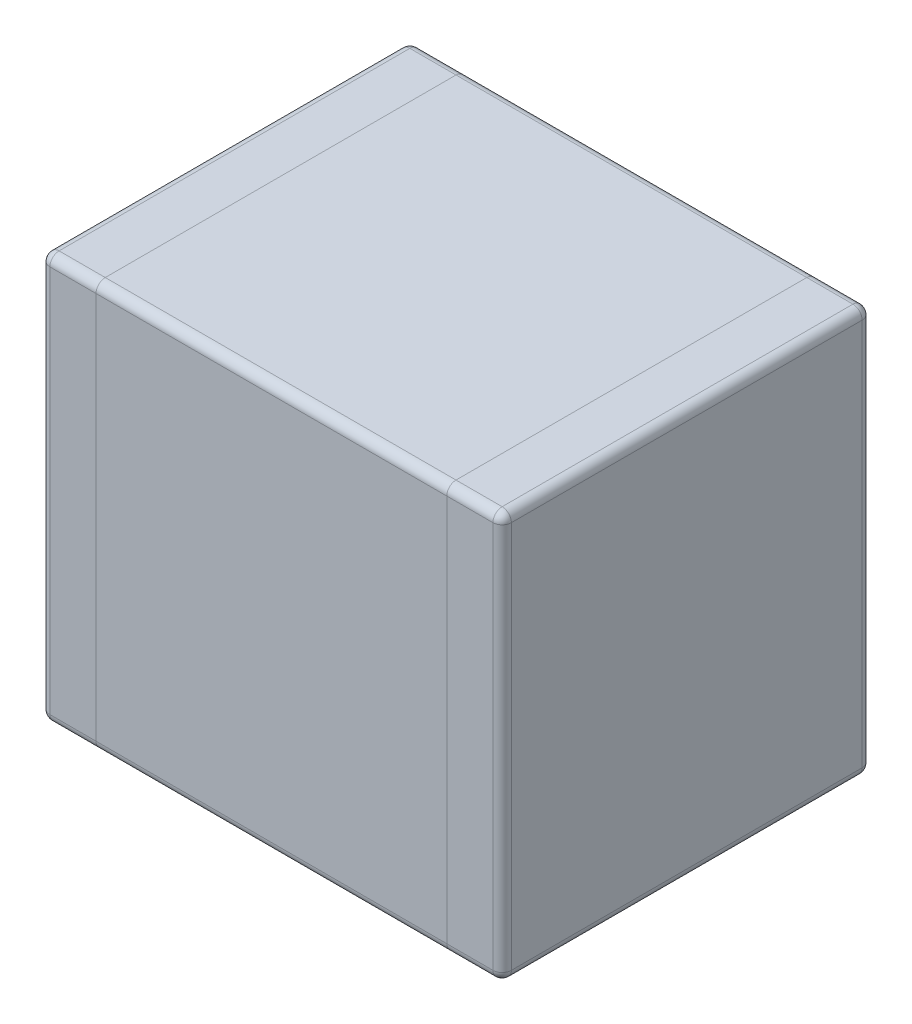
ISO-10303-21;
HEADER;
FILE_DESCRIPTION(('STEP AP214'),'2;1');
FILE_NAME('part.step','',(''),(''),'','','');
FILE_SCHEMA(('AUTOMOTIVE_DESIGN { 1 0 10303 214 1 1 1 1 }'));
ENDSEC;
DATA;
#1=APPLICATION_CONTEXT('core data for automotive mechanical design processes');
#2=APPLICATION_PROTOCOL_DEFINITION('international standard','automotive_design',2000,#1);
#3=PRODUCT_CONTEXT('',#1,'mechanical');
#4=PRODUCT('Part','Part','',(#3));
#5=PRODUCT_RELATED_PRODUCT_CATEGORY('part','',(#4));
#6=PRODUCT_DEFINITION_FORMATION('','',#4);
#7=PRODUCT_DEFINITION_CONTEXT('part definition',#1,'design');
#8=PRODUCT_DEFINITION('design','',#6,#7);
#9=PRODUCT_DEFINITION_SHAPE('','',#8);
#10=(LENGTH_UNIT() NAMED_UNIT(*) SI_UNIT(.MILLI.,.METRE.));
#11=(NAMED_UNIT(*) PLANE_ANGLE_UNIT() SI_UNIT($,.RADIAN.));
#12=(NAMED_UNIT(*) SI_UNIT($,.STERADIAN.) SOLID_ANGLE_UNIT());
#13=UNCERTAINTY_MEASURE_WITH_UNIT(LENGTH_MEASURE(1.E-05),#10,'distance_accuracy_value','');
#14=(GEOMETRIC_REPRESENTATION_CONTEXT(3) GLOBAL_UNCERTAINTY_ASSIGNED_CONTEXT((#13)) GLOBAL_UNIT_ASSIGNED_CONTEXT((#10,
#11,#12)) REPRESENTATION_CONTEXT('',''));
#15=CARTESIAN_POINT('',(0.,0.,0.));
#16=DIRECTION('',(0.,0.,1.));
#17=DIRECTION('',(1.,0.,0.));
#18=AXIS2_PLACEMENT_3D('',#15,#16,#17);
#19=CARTESIAN_POINT('',(1.25,2.2,-1.));
#20=DIRECTION('',(0.,-1.,0.));
#21=DIRECTION('',(0.,0.,-1.));
#22=AXIS2_PLACEMENT_3D('',#19,#20,#21);
#23=PLANE('',#22);
#24=DIRECTION('',(0.,0.,1.));
#25=VECTOR('',#24,1.);
#26=CARTESIAN_POINT('',(-0.95,2.2,-1.));
#27=LINE('',#26,#25);
#28=CARTESIAN_POINT('',(-0.95,2.2,-0.95));
#29=VERTEX_POINT('',#28);
#30=CARTESIAN_POINT('',(-0.95,2.2,0.95));
#31=VERTEX_POINT('',#30);
#32=EDGE_CURVE('E11',#29,#31,#27,.T.);
#33=ORIENTED_EDGE('',*,*,#32,.F.);
#34=DIRECTION('',(-1.,0.,0.));
#35=VECTOR('',#34,1.);
#36=CARTESIAN_POINT('',(1.25,2.2,-0.95));
#37=LINE('',#36,#35);
#38=CARTESIAN_POINT('',(-1.2,2.2,-0.95));
#39=VERTEX_POINT('',#38);
#40=EDGE_CURVE('E253',#29,#39,#37,.T.);
#41=ORIENTED_EDGE('',*,*,#40,.T.);
#42=DIRECTION('',(0.,0.,1.));
#43=VECTOR('',#42,1.);
#44=CARTESIAN_POINT('',(-1.2,2.2,-1.));
#45=LINE('',#44,#43);
#46=CARTESIAN_POINT('',(-1.2,2.2,0.95));
#47=VERTEX_POINT('',#46);
#48=EDGE_CURVE('E256',#39,#47,#45,.T.);
#49=ORIENTED_EDGE('',*,*,#48,.T.);
#50=DIRECTION('',(1.,0.,0.));
#51=VECTOR('',#50,1.);
#52=CARTESIAN_POINT('',(1.25,2.2,0.95));
#53=LINE('',#52,#51);
#54=EDGE_CURVE('E260',#47,#31,#53,.T.);
#55=ORIENTED_EDGE('',*,*,#54,.T.);
#56=EDGE_LOOP('',(#33,#41,#49,#55));
#57=FACE_BOUND('',#56,.T.);
#58=ADVANCED_FACE('F37',(#57),#23,.F.);
#59=DIRECTION('',(0.,0.,-1.));
#60=VECTOR('',#59,1.);
#61=CARTESIAN_POINT('',(0.95,2.2,-1.));
#62=LINE('',#61,#60);
#63=CARTESIAN_POINT('',(0.95,2.2,0.95));
#64=VERTEX_POINT('',#63);
#65=CARTESIAN_POINT('',(0.95,2.2,-0.95));
#66=VERTEX_POINT('',#65);
#67=EDGE_CURVE('E47',#64,#66,#62,.T.);
#68=ORIENTED_EDGE('',*,*,#67,.F.);
#69=CARTESIAN_POINT('',(1.2,2.2,0.95));
#70=VERTEX_POINT('',#69);
#71=EDGE_CURVE('E259',#64,#70,#53,.T.);
#72=ORIENTED_EDGE('',*,*,#71,.T.);
#73=DIRECTION('',(0.,0.,-1.));
#74=VECTOR('',#73,1.);
#75=CARTESIAN_POINT('',(1.2,2.2,-1.));
#76=LINE('',#75,#74);
#77=CARTESIAN_POINT('',(1.2,2.2,-0.95));
#78=VERTEX_POINT('',#77);
#79=EDGE_CURVE('E250',#70,#78,#76,.T.);
#80=ORIENTED_EDGE('',*,*,#79,.T.);
#81=EDGE_CURVE('E254',#78,#66,#37,.T.);
#82=ORIENTED_EDGE('',*,*,#81,.T.);
#83=EDGE_LOOP('',(#68,#72,#80,#82));
#84=FACE_BOUND('',#83,.T.);
#85=ADVANCED_FACE('F526',(#84),#23,.F.);
#86=CARTESIAN_POINT('',(1.25,2.15,0.95));
#87=DIRECTION('',(1.,0.,0.));
#88=DIRECTION('',(0.,0.,-1.));
#89=AXIS2_PLACEMENT_3D('',#86,#87,#88);
#90=CYLINDRICAL_SURFACE('',#89,0.05);
#91=DIRECTION('',(1.,0.,0.));
#92=VECTOR('',#91,1.);
#93=CARTESIAN_POINT('',(-1.25,2.15,1.));
#94=LINE('',#93,#92);
#95=CARTESIAN_POINT('',(-0.95,2.15,1.));
#96=VERTEX_POINT('',#95);
#97=CARTESIAN_POINT('',(-1.2,2.15,1.));
#98=VERTEX_POINT('',#97);
#99=EDGE_CURVE('E246',#96,#98,#94,.F.);
#100=ORIENTED_EDGE('',*,*,#99,.F.);
#101=CARTESIAN_POINT('',(-0.95,2.15,0.95));
#102=DIRECTION('',(1.,0.,0.));
#103=DIRECTION('',(0.,0.,-1.));
#104=AXIS2_PLACEMENT_3D('',#101,#102,#103);
#105=CIRCLE('',#104,0.05);
#106=EDGE_CURVE('E354',#96,#31,#105,.F.);
#107=ORIENTED_EDGE('',*,*,#106,.T.);
#108=ORIENTED_EDGE('',*,*,#54,.F.);
#109=CARTESIAN_POINT('',(-1.2,2.15,0.95));
#110=DIRECTION('',(-1.,0.,0.));
#111=DIRECTION('',(0.,-1.,0.));
#112=AXIS2_PLACEMENT_3D('',#109,#110,#111);
#113=CIRCLE('',#112,0.05);
#114=EDGE_CURVE('E330',#47,#98,#113,.F.);
#115=ORIENTED_EDGE('',*,*,#114,.T.);
#116=EDGE_LOOP('',(#100,#107,#108,#115));
#117=FACE_BOUND('',#116,.T.);
#118=ADVANCED_FACE('F483',(#117),#90,.T.);
#119=ORIENTED_EDGE('',*,*,#71,.F.);
#120=CARTESIAN_POINT('',(0.95,2.15,0.95));
#121=DIRECTION('',(-1.,0.,0.));
#122=DIRECTION('',(0.,0.,1.));
#123=AXIS2_PLACEMENT_3D('',#120,#121,#122);
#124=CIRCLE('',#123,0.05);
#125=CARTESIAN_POINT('',(0.95,2.15,1.));
#126=VERTEX_POINT('',#125);
#127=EDGE_CURVE('E353',#64,#126,#124,.F.);
#128=ORIENTED_EDGE('',*,*,#127,.T.);
#129=CARTESIAN_POINT('',(1.2,2.15,1.));
#130=VERTEX_POINT('',#129);
#131=EDGE_CURVE('E247',#130,#126,#94,.F.);
#132=ORIENTED_EDGE('',*,*,#131,.F.);
#133=CARTESIAN_POINT('',(1.2,2.15,0.95));
#134=DIRECTION('',(1.,0.,0.));
#135=DIRECTION('',(0.,0.,-1.));
#136=AXIS2_PLACEMENT_3D('',#133,#134,#135);
#137=CIRCLE('',#136,0.05);
#138=EDGE_CURVE('E315',#70,#130,#137,.T.);
#139=ORIENTED_EDGE('',*,*,#138,.F.);
#140=EDGE_LOOP('',(#119,#128,#132,#139));
#141=FACE_BOUND('',#140,.T.);
#142=ADVANCED_FACE('F457',(#141),#90,.T.);
#143=CARTESIAN_POINT('',(-1.25,2.2,1.));
#144=DIRECTION('',(0.,0.,-1.));
#145=DIRECTION('',(-1.,0.,0.));
#146=AXIS2_PLACEMENT_3D('',#143,#144,#145);
#147=PLANE('',#146);
#148=DIRECTION('',(0.,-1.,0.));
#149=VECTOR('',#148,1.);
#150=CARTESIAN_POINT('',(-0.95,2.2,1.));
#151=LINE('',#150,#149);
#152=CARTESIAN_POINT('',(-0.95,0.0500000000000001,1.));
#153=VERTEX_POINT('',#152);
#154=EDGE_CURVE('E349',#96,#153,#151,.T.);
#155=ORIENTED_EDGE('',*,*,#154,.F.);
#156=ORIENTED_EDGE('',*,*,#99,.T.);
#157=DIRECTION('',(0.,-1.,0.));
#158=VECTOR('',#157,1.);
#159=CARTESIAN_POINT('',(-1.2,2.2,1.));
#160=LINE('',#159,#158);
#161=CARTESIAN_POINT('',(-1.2,0.0500000000000001,1.));
#162=VERTEX_POINT('',#161);
#163=EDGE_CURVE('E243',#98,#162,#160,.T.);
#164=ORIENTED_EDGE('',*,*,#163,.T.);
#165=DIRECTION('',(1.,0.,0.));
#166=VECTOR('',#165,1.);
#167=CARTESIAN_POINT('',(1.25,0.0500000000000001,1.));
#168=LINE('',#167,#166);
#169=EDGE_CURVE('E237',#162,#153,#168,.T.);
#170=ORIENTED_EDGE('',*,*,#169,.T.);
#171=EDGE_LOOP('',(#155,#156,#164,#170));
#172=FACE_BOUND('',#171,.T.);
#173=ADVANCED_FACE('F471',(#172),#147,.F.);
#174=DIRECTION('',(0.,1.,0.));
#175=VECTOR('',#174,1.);
#176=CARTESIAN_POINT('',(0.95,2.2,1.));
#177=LINE('',#176,#175);
#178=CARTESIAN_POINT('',(0.95,0.0500000000000001,1.));
#179=VERTEX_POINT('',#178);
#180=EDGE_CURVE('E345',#179,#126,#177,.T.);
#181=ORIENTED_EDGE('',*,*,#180,.F.);
#182=CARTESIAN_POINT('',(1.2,0.0500000000000001,1.));
#183=VERTEX_POINT('',#182);
#184=EDGE_CURVE('E236',#179,#183,#168,.T.);
#185=ORIENTED_EDGE('',*,*,#184,.T.);
#186=DIRECTION('',(0.,-1.,0.));
#187=VECTOR('',#186,1.);
#188=CARTESIAN_POINT('',(1.2,2.2,1.));
#189=LINE('',#188,#187);
#190=EDGE_CURVE('E240',#183,#130,#189,.F.);
#191=ORIENTED_EDGE('',*,*,#190,.T.);
#192=ORIENTED_EDGE('',*,*,#131,.T.);
#193=EDGE_LOOP('',(#181,#185,#191,#192));
#194=FACE_BOUND('',#193,.T.);
#195=ADVANCED_FACE('F453',(#194),#147,.F.);
#196=CARTESIAN_POINT('',(-1.25,0.0500000000000001,0.95));
#197=DIRECTION('',(-1.,0.,0.));
#198=DIRECTION('',(0.,0.,1.));
#199=AXIS2_PLACEMENT_3D('',#196,#197,#198);
#200=CYLINDRICAL_SURFACE('',#199,0.05);
#201=DIRECTION('',(1.,0.,0.));
#202=VECTOR('',#201,1.);
#203=CARTESIAN_POINT('',(-1.25,0.,0.95));
#204=LINE('',#203,#202);
#205=CARTESIAN_POINT('',(-0.95,0.,0.95));
#206=VERTEX_POINT('',#205);
#207=CARTESIAN_POINT('',(-1.2,0.,0.95));
#208=VERTEX_POINT('',#207);
#209=EDGE_CURVE('E266',#206,#208,#204,.F.);
#210=ORIENTED_EDGE('',*,*,#209,.F.);
#211=CARTESIAN_POINT('',(-0.95,0.0500000000000001,0.95));
#212=DIRECTION('',(1.,0.,0.));
#213=DIRECTION('',(0.,0.,-1.));
#214=AXIS2_PLACEMENT_3D('',#211,#212,#213);
#215=CIRCLE('',#214,0.05);
#216=EDGE_CURVE('E350',#206,#153,#215,.F.);
#217=ORIENTED_EDGE('',*,*,#216,.T.);
#218=ORIENTED_EDGE('',*,*,#169,.F.);
#219=CARTESIAN_POINT('',(-1.2,0.05,0.95));
#220=DIRECTION('',(-1.,0.,0.));
#221=DIRECTION('',(0.,0.,1.));
#222=AXIS2_PLACEMENT_3D('',#219,#220,#221);
#223=CIRCLE('',#222,0.05);
#224=EDGE_CURVE('E321',#162,#208,#223,.F.);
#225=ORIENTED_EDGE('',*,*,#224,.T.);
#226=EDGE_LOOP('',(#210,#217,#218,#225));
#227=FACE_BOUND('',#226,.T.);
#228=ADVANCED_FACE('F509',(#227),#200,.T.);
#229=ORIENTED_EDGE('',*,*,#184,.F.);
#230=CARTESIAN_POINT('',(0.95,0.0500000000000001,0.95));
#231=DIRECTION('',(-1.,0.,0.));
#232=DIRECTION('',(0.,0.,1.));
#233=AXIS2_PLACEMENT_3D('',#230,#231,#232);
#234=CIRCLE('',#233,0.05);
#235=CARTESIAN_POINT('',(0.95,0.,0.95));
#236=VERTEX_POINT('',#235);
#237=EDGE_CURVE('E365',#179,#236,#234,.F.);
#238=ORIENTED_EDGE('',*,*,#237,.T.);
#239=CARTESIAN_POINT('',(1.2,0.,0.95));
#240=VERTEX_POINT('',#239);
#241=EDGE_CURVE('E267',#240,#236,#204,.F.);
#242=ORIENTED_EDGE('',*,*,#241,.F.);
#243=CARTESIAN_POINT('',(1.2,0.0500000000000001,0.95));
#244=DIRECTION('',(1.,0.,0.));
#245=DIRECTION('',(0.,0.,-1.));
#246=AXIS2_PLACEMENT_3D('',#243,#244,#245);
#247=CIRCLE('',#246,0.05);
#248=EDGE_CURVE('E301',#183,#240,#247,.T.);
#249=ORIENTED_EDGE('',*,*,#248,.F.);
#250=EDGE_LOOP('',(#229,#238,#242,#249));
#251=FACE_BOUND('',#250,.T.);
#252=ADVANCED_FACE('F443',(#251),#200,.T.);
#253=CARTESIAN_POINT('',(1.25,0.,-1.));
#254=DIRECTION('',(0.,-1.,0.));
#255=DIRECTION('',(0.,0.,-1.));
#256=AXIS2_PLACEMENT_3D('',#253,#254,#255);
#257=PLANE('',#256);
#258=DIRECTION('',(-1.,0.,0.));
#259=VECTOR('',#258,1.);
#260=CARTESIAN_POINT('',(1.25,0.,-0.95));
#261=LINE('',#260,#259);
#262=CARTESIAN_POINT('',(-1.2,0.,-0.95));
#263=VERTEX_POINT('',#262);
#264=CARTESIAN_POINT('',(-0.95,0.,-0.95));
#265=VERTEX_POINT('',#264);
#266=EDGE_CURVE('E274',#263,#265,#261,.F.);
#267=ORIENTED_EDGE('',*,*,#266,.T.);
#268=DIRECTION('',(0.,0.,1.));
#269=VECTOR('',#268,1.);
#270=CARTESIAN_POINT('',(-0.95,0.,-1.));
#271=LINE('',#270,#269);
#272=EDGE_CURVE('E366',#265,#206,#271,.T.);
#273=ORIENTED_EDGE('',*,*,#272,.T.);
#274=ORIENTED_EDGE('',*,*,#209,.T.);
#275=DIRECTION('',(0.,0.,1.));
#276=VECTOR('',#275,1.);
#277=CARTESIAN_POINT('',(-1.2,0.,-1.));
#278=LINE('',#277,#276);
#279=EDGE_CURVE('E270',#208,#263,#278,.F.);
#280=ORIENTED_EDGE('',*,*,#279,.T.);
#281=EDGE_LOOP('',(#267,#273,#274,#280));
#282=FACE_BOUND('',#281,.T.);
#283=ADVANCED_FACE('F512',(#282),#257,.T.);
#284=ORIENTED_EDGE('',*,*,#241,.T.);
#285=DIRECTION('',(0.,0.,-1.));
#286=VECTOR('',#285,1.);
#287=CARTESIAN_POINT('',(0.95,0.,-1.));
#288=LINE('',#287,#286);
#289=CARTESIAN_POINT('',(0.95,0.,-0.95));
#290=VERTEX_POINT('',#289);
#291=EDGE_CURVE('E360',#236,#290,#288,.T.);
#292=ORIENTED_EDGE('',*,*,#291,.T.);
#293=CARTESIAN_POINT('',(1.2,0.,-0.95));
#294=VERTEX_POINT('',#293);
#295=EDGE_CURVE('E273',#290,#294,#261,.F.);
#296=ORIENTED_EDGE('',*,*,#295,.T.);
#297=DIRECTION('',(0.,0.,-1.));
#298=VECTOR('',#297,1.);
#299=CARTESIAN_POINT('',(1.2,0.,1.));
#300=LINE('',#299,#298);
#301=EDGE_CURVE('E263',#294,#240,#300,.F.);
#302=ORIENTED_EDGE('',*,*,#301,.T.);
#303=EDGE_LOOP('',(#284,#292,#296,#302));
#304=FACE_BOUND('',#303,.T.);
#305=ADVANCED_FACE('F387',(#304),#257,.T.);
#306=CARTESIAN_POINT('',(1.25,2.15,-0.95));
#307=DIRECTION('',(-1.,0.,0.));
#308=DIRECTION('',(0.,0.,1.));
#309=AXIS2_PLACEMENT_3D('',#306,#307,#308);
#310=CYLINDRICAL_SURFACE('',#309,0.05);
#311=ORIENTED_EDGE('',*,*,#40,.F.);
#312=CARTESIAN_POINT('',(-0.95,2.15,-0.95));
#313=DIRECTION('',(1.,0.,0.));
#314=DIRECTION('',(0.,0.,-1.));
#315=AXIS2_PLACEMENT_3D('',#312,#313,#314);
#316=CIRCLE('',#315,0.05);
#317=CARTESIAN_POINT('',(-0.95,2.15,-1.));
#318=VERTEX_POINT('',#317);
#319=EDGE_CURVE('E357',#29,#318,#316,.F.);
#320=ORIENTED_EDGE('',*,*,#319,.T.);
#321=DIRECTION('',(-1.,0.,0.));
#322=VECTOR('',#321,1.);
#323=CARTESIAN_POINT('',(-1.25,2.15,-1.));
#324=LINE('',#323,#322);
#325=CARTESIAN_POINT('',(-1.2,2.15,-1.));
#326=VERTEX_POINT('',#325);
#327=EDGE_CURVE('E216',#326,#318,#324,.F.);
#328=ORIENTED_EDGE('',*,*,#327,.F.);
#329=CARTESIAN_POINT('',(-1.2,2.15,-0.95));
#330=DIRECTION('',(-1.,0.,0.));
#331=DIRECTION('',(0.,0.,1.));
#332=AXIS2_PLACEMENT_3D('',#329,#330,#331);
#333=CIRCLE('',#332,0.05);
#334=EDGE_CURVE('E292',#326,#39,#333,.F.);
#335=ORIENTED_EDGE('',*,*,#334,.T.);
#336=EDGE_LOOP('',(#311,#320,#328,#335));
#337=FACE_BOUND('',#336,.T.);
#338=ADVANCED_FACE('F519',(#337),#310,.T.);
#339=CARTESIAN_POINT('',(0.95,2.15,-1.));
#340=VERTEX_POINT('',#339);
#341=CARTESIAN_POINT('',(1.2,2.15,-1.));
#342=VERTEX_POINT('',#341);
#343=EDGE_CURVE('E211',#340,#342,#324,.F.);
#344=ORIENTED_EDGE('',*,*,#343,.F.);
#345=CARTESIAN_POINT('',(0.95,2.15,-0.95));
#346=DIRECTION('',(-1.,0.,0.));
#347=DIRECTION('',(0.,0.,1.));
#348=AXIS2_PLACEMENT_3D('',#345,#346,#347);
#349=CIRCLE('',#348,0.05);
#350=EDGE_CURVE('E361',#340,#66,#349,.F.);
#351=ORIENTED_EDGE('',*,*,#350,.T.);
#352=ORIENTED_EDGE('',*,*,#81,.F.);
#353=CARTESIAN_POINT('',(1.2,2.15,-0.95));
#354=DIRECTION('',(1.,0.,0.));
#355=DIRECTION('',(0.,1.,0.));
#356=AXIS2_PLACEMENT_3D('',#353,#354,#355);
#357=CIRCLE('',#356,0.05);
#358=EDGE_CURVE('E196',#342,#78,#357,.T.);
#359=ORIENTED_EDGE('',*,*,#358,.F.);
#360=EDGE_LOOP('',(#344,#351,#352,#359));
#361=FACE_BOUND('',#360,.T.);
#362=ADVANCED_FACE('F422',(#361),#310,.T.);
#363=CARTESIAN_POINT('',(-1.25,0.0500000000000001,-0.95));
#364=DIRECTION('',(1.,0.,0.));
#365=DIRECTION('',(0.,0.,-1.));
#366=AXIS2_PLACEMENT_3D('',#363,#364,#365);
#367=CYLINDRICAL_SURFACE('',#366,0.05);
#368=DIRECTION('',(-1.,0.,0.));
#369=VECTOR('',#368,1.);
#370=CARTESIAN_POINT('',(-1.25,0.0500000000000001,-1.));
#371=LINE('',#370,#369);
#372=CARTESIAN_POINT('',(-0.95,0.0500000000000001,-1.));
#373=VERTEX_POINT('',#372);
#374=CARTESIAN_POINT('',(-1.2,0.0500000000000001,-1.));
#375=VERTEX_POINT('',#374);
#376=EDGE_CURVE('E208',#373,#375,#371,.T.);
#377=ORIENTED_EDGE('',*,*,#376,.F.);
#378=CARTESIAN_POINT('',(-0.95,0.0500000000000001,-0.95));
#379=DIRECTION('',(1.,0.,0.));
#380=DIRECTION('',(0.,0.,-1.));
#381=AXIS2_PLACEMENT_3D('',#378,#379,#380);
#382=CIRCLE('',#381,0.05);
#383=EDGE_CURVE('E370',#373,#265,#382,.F.);
#384=ORIENTED_EDGE('',*,*,#383,.T.);
#385=ORIENTED_EDGE('',*,*,#266,.F.);
#386=CARTESIAN_POINT('',(-1.2,0.0500000000000001,-0.95));
#387=DIRECTION('',(-1.,0.,0.));
#388=DIRECTION('',(0.,0.,1.));
#389=AXIS2_PLACEMENT_3D('',#386,#387,#388);
#390=CIRCLE('',#389,0.05);
#391=EDGE_CURVE('E289',#263,#375,#390,.F.);
#392=ORIENTED_EDGE('',*,*,#391,.T.);
#393=EDGE_LOOP('',(#377,#384,#385,#392));
#394=FACE_BOUND('',#393,.T.);
#395=ADVANCED_FACE('F405',(#394),#367,.T.);
#396=ORIENTED_EDGE('',*,*,#295,.F.);
#397=CARTESIAN_POINT('',(0.95,0.0500000000000001,-0.95));
#398=DIRECTION('',(-1.,0.,0.));
#399=DIRECTION('',(0.,0.,1.));
#400=AXIS2_PLACEMENT_3D('',#397,#398,#399);
#401=CIRCLE('',#400,0.05);
#402=CARTESIAN_POINT('',(0.95,0.0500000000000001,-1.));
#403=VERTEX_POINT('',#402);
#404=EDGE_CURVE('E41',#290,#403,#401,.F.);
#405=ORIENTED_EDGE('',*,*,#404,.T.);
#406=CARTESIAN_POINT('',(1.2,0.0500000000000001,-1.));
#407=VERTEX_POINT('',#406);
#408=EDGE_CURVE('E199',#407,#403,#371,.T.);
#409=ORIENTED_EDGE('',*,*,#408,.F.);
#410=CARTESIAN_POINT('',(1.2,0.05,-0.95));
#411=DIRECTION('',(1.,0.,0.));
#412=DIRECTION('',(0.,0.,-1.));
#413=AXIS2_PLACEMENT_3D('',#410,#411,#412);
#414=CIRCLE('',#413,0.05);
#415=EDGE_CURVE('E188',#294,#407,#414,.T.);
#416=ORIENTED_EDGE('',*,*,#415,.F.);
#417=EDGE_LOOP('',(#396,#405,#409,#416));
#418=FACE_BOUND('',#417,.T.);
#419=ADVANCED_FACE('F200',(#418),#367,.T.);
#420=CARTESIAN_POINT('',(-1.25,2.2,-1.));
#421=DIRECTION('',(0.,0.,1.));
#422=DIRECTION('',(1.,0.,0.));
#423=AXIS2_PLACEMENT_3D('',#420,#421,#422);
#424=PLANE('',#423);
#425=DIRECTION('',(0.,1.,0.));
#426=VECTOR('',#425,1.);
#427=CARTESIAN_POINT('',(-0.95,2.2,-1.));
#428=LINE('',#427,#426);
#429=EDGE_CURVE('E341',#373,#318,#428,.T.);
#430=ORIENTED_EDGE('',*,*,#429,.F.);
#431=ORIENTED_EDGE('',*,*,#376,.T.);
#432=DIRECTION('',(0.,-1.,0.));
#433=VECTOR('',#432,1.);
#434=CARTESIAN_POINT('',(-1.2,2.2,-1.));
#435=LINE('',#434,#433);
#436=EDGE_CURVE('E205',#375,#326,#435,.F.);
#437=ORIENTED_EDGE('',*,*,#436,.T.);
#438=ORIENTED_EDGE('',*,*,#327,.T.);
#439=EDGE_LOOP('',(#430,#431,#437,#438));
#440=FACE_BOUND('',#439,.T.);
#441=ADVANCED_FACE('F408',(#440),#424,.F.);
#442=DIRECTION('',(0.,-1.,0.));
#443=VECTOR('',#442,1.);
#444=CARTESIAN_POINT('',(0.95,2.2,-1.));
#445=LINE('',#444,#443);
#446=EDGE_CURVE('E276',#340,#403,#445,.T.);
#447=ORIENTED_EDGE('',*,*,#446,.F.);
#448=ORIENTED_EDGE('',*,*,#343,.T.);
#449=DIRECTION('',(0.,-1.,0.));
#450=VECTOR('',#449,1.);
#451=CARTESIAN_POINT('',(1.2,2.2,-1.));
#452=LINE('',#451,#450);
#453=EDGE_CURVE('E180',#342,#407,#452,.T.);
#454=ORIENTED_EDGE('',*,*,#453,.T.);
#455=ORIENTED_EDGE('',*,*,#408,.T.);
#456=EDGE_LOOP('',(#447,#448,#454,#455));
#457=FACE_BOUND('',#456,.T.);
#458=ADVANCED_FACE('F209',(#457),#424,.F.);
#459=CARTESIAN_POINT('',(1.25,2.2,1.));
#460=DIRECTION('',(-1.,0.,0.));
#461=DIRECTION('',(0.,0.,1.));
#462=AXIS2_PLACEMENT_3D('',#459,#460,#461);
#463=PLANE('',#462);
#464=DIRECTION('',(0.,-1.,0.));
#465=VECTOR('',#464,1.);
#466=CARTESIAN_POINT('',(1.25,2.2,-0.95));
#467=LINE('',#466,#465);
#468=CARTESIAN_POINT('',(1.25,0.0500000000000001,-0.95));
#469=VERTEX_POINT('',#468);
#470=CARTESIAN_POINT('',(1.25,2.15,-0.95));
#471=VERTEX_POINT('',#470);
#472=EDGE_CURVE('E182',#469,#471,#467,.F.);
#473=ORIENTED_EDGE('',*,*,#472,.T.);
#474=DIRECTION('',(0.,0.,-1.));
#475=VECTOR('',#474,1.);
#476=CARTESIAN_POINT('',(1.25,2.15,1.));
#477=LINE('',#476,#475);
#478=CARTESIAN_POINT('',(1.25,2.15,0.95));
#479=VERTEX_POINT('',#478);
#480=EDGE_CURVE('E225',#471,#479,#477,.F.);
#481=ORIENTED_EDGE('',*,*,#480,.T.);
#482=DIRECTION('',(0.,-1.,0.));
#483=VECTOR('',#482,1.);
#484=CARTESIAN_POINT('',(1.25,2.2,0.95));
#485=LINE('',#484,#483);
#486=CARTESIAN_POINT('',(1.25,0.0500000000000001,0.95));
#487=VERTEX_POINT('',#486);
#488=EDGE_CURVE('E222',#479,#487,#485,.T.);
#489=ORIENTED_EDGE('',*,*,#488,.T.);
#490=DIRECTION('',(0.,0.,-1.));
#491=VECTOR('',#490,1.);
#492=CARTESIAN_POINT('',(1.25,0.0500000000000001,-1.));
#493=LINE('',#492,#491);
#494=EDGE_CURVE('E220',#487,#469,#493,.T.);
#495=ORIENTED_EDGE('',*,*,#494,.T.);
#496=EDGE_LOOP('',(#473,#481,#489,#495));
#497=FACE_BOUND('',#496,.T.);
#498=ADVANCED_FACE('F434',(#497),#463,.F.);
#499=EDGE_CURVE('E206',#403,#373,#371,.T.);
#500=ORIENTED_EDGE('',*,*,#499,.T.);
#501=ORIENTED_EDGE('',*,*,#429,.T.);
#502=EDGE_CURVE('E214',#318,#340,#324,.F.);
#503=ORIENTED_EDGE('',*,*,#502,.T.);
#504=ORIENTED_EDGE('',*,*,#446,.T.);
#505=EDGE_LOOP('',(#500,#501,#503,#504));
#506=FACE_BOUND('',#505,.T.);
#507=ADVANCED_FACE('F414',(#506),#424,.F.);
#508=CARTESIAN_POINT('',(-1.25,2.2,1.));
#509=DIRECTION('',(1.,0.,0.));
#510=DIRECTION('',(0.,0.,-1.));
#511=AXIS2_PLACEMENT_3D('',#508,#509,#510);
#512=PLANE('',#511);
#513=DIRECTION('',(0.,-1.,0.));
#514=VECTOR('',#513,1.);
#515=CARTESIAN_POINT('',(-1.25,2.2,0.95));
#516=LINE('',#515,#514);
#517=CARTESIAN_POINT('',(-1.25,0.0500000000000001,0.95));
#518=VERTEX_POINT('',#517);
#519=CARTESIAN_POINT('',(-1.25,2.15,0.95));
#520=VERTEX_POINT('',#519);
#521=EDGE_CURVE('E229',#518,#520,#516,.F.);
#522=ORIENTED_EDGE('',*,*,#521,.T.);
#523=DIRECTION('',(0.,0.,1.));
#524=VECTOR('',#523,1.);
#525=CARTESIAN_POINT('',(-1.25,2.15,1.));
#526=LINE('',#525,#524);
#527=CARTESIAN_POINT('',(-1.25,2.15,-0.95));
#528=VERTEX_POINT('',#527);
#529=EDGE_CURVE('E234',#520,#528,#526,.F.);
#530=ORIENTED_EDGE('',*,*,#529,.T.);
#531=DIRECTION('',(0.,-1.,0.));
#532=VECTOR('',#531,1.);
#533=CARTESIAN_POINT('',(-1.25,2.2,-0.95));
#534=LINE('',#533,#532);
#535=CARTESIAN_POINT('',(-1.25,0.0500000000000001,-0.95));
#536=VERTEX_POINT('',#535);
#537=EDGE_CURVE('E231',#528,#536,#534,.T.);
#538=ORIENTED_EDGE('',*,*,#537,.T.);
#539=DIRECTION('',(0.,0.,1.));
#540=VECTOR('',#539,1.);
#541=CARTESIAN_POINT('',(-1.25,0.0500000000000001,1.));
#542=LINE('',#541,#540);
#543=EDGE_CURVE('E227',#536,#518,#542,.T.);
#544=ORIENTED_EDGE('',*,*,#543,.T.);
#545=EDGE_LOOP('',(#522,#530,#538,#544));
#546=FACE_BOUND('',#545,.T.);
#547=ADVANCED_FACE('F491',(#546),#512,.F.);
#548=EDGE_CURVE('E251',#126,#96,#94,.F.);
#549=ORIENTED_EDGE('',*,*,#548,.T.);
#550=ORIENTED_EDGE('',*,*,#154,.T.);
#551=EDGE_CURVE('E241',#153,#179,#168,.T.);
#552=ORIENTED_EDGE('',*,*,#551,.T.);
#553=ORIENTED_EDGE('',*,*,#180,.T.);
#554=EDGE_LOOP('',(#549,#550,#552,#553));
#555=FACE_BOUND('',#554,.T.);
#556=ADVANCED_FACE('F464',(#555),#147,.F.);
#557=EDGE_CURVE('E257',#66,#29,#37,.T.);
#558=ORIENTED_EDGE('',*,*,#557,.T.);
#559=ORIENTED_EDGE('',*,*,#32,.T.);
#560=EDGE_CURVE('E264',#31,#64,#53,.T.);
#561=ORIENTED_EDGE('',*,*,#560,.T.);
#562=ORIENTED_EDGE('',*,*,#67,.T.);
#563=EDGE_LOOP('',(#558,#559,#561,#562));
#564=FACE_BOUND('',#563,.T.);
#565=ADVANCED_FACE('F524',(#564),#23,.F.);
#566=ORIENTED_EDGE('',*,*,#272,.F.);
#567=EDGE_CURVE('E277',#265,#290,#261,.F.);
#568=ORIENTED_EDGE('',*,*,#567,.T.);
#569=ORIENTED_EDGE('',*,*,#291,.F.);
#570=EDGE_CURVE('E271',#236,#206,#204,.F.);
#571=ORIENTED_EDGE('',*,*,#570,.T.);
#572=EDGE_LOOP('',(#566,#568,#569,#571));
#573=FACE_BOUND('',#572,.T.);
#574=ADVANCED_FACE('F399',(#573),#257,.T.);
#575=CARTESIAN_POINT('',(-1.2,2.2,0.95));
#576=DIRECTION('',(0.,-1.,0.));
#577=DIRECTION('',(0.,0.,-1.));
#578=AXIS2_PLACEMENT_3D('',#575,#576,#577);
#579=CYLINDRICAL_SURFACE('',#578,0.05);
#580=CARTESIAN_POINT('',(-1.2,2.15,0.95));
#581=DIRECTION('',(0.,1.,0.));
#582=DIRECTION('',(0.,0.,1.));
#583=AXIS2_PLACEMENT_3D('',#580,#581,#582);
#584=CIRCLE('',#583,0.05);
#585=EDGE_CURVE('E336',#520,#98,#584,.T.);
#586=ORIENTED_EDGE('',*,*,#585,.F.);
#587=ORIENTED_EDGE('',*,*,#521,.F.);
#588=CARTESIAN_POINT('',(-1.2,0.0500000000000001,0.95));
#589=DIRECTION('',(0.,-1.,0.));
#590=DIRECTION('',(0.,0.,-1.));
#591=AXIS2_PLACEMENT_3D('',#588,#589,#590);
#592=CIRCLE('',#591,0.05);
#593=EDGE_CURVE('E333',#162,#518,#592,.T.);
#594=ORIENTED_EDGE('',*,*,#593,.F.);
#595=ORIENTED_EDGE('',*,*,#163,.F.);
#596=EDGE_LOOP('',(#586,#587,#594,#595));
#597=FACE_BOUND('',#596,.T.);
#598=ADVANCED_FACE('F39',(#597),#579,.T.);
#599=CARTESIAN_POINT('',(-1.2,2.15,0.95));
#600=DIRECTION('',(0.,0.,1.));
#601=DIRECTION('',(1.,0.,0.));
#602=AXIS2_PLACEMENT_3D('',#599,#600,#601);
#603=SPHERICAL_SURFACE('',#602,0.05);
#604=CARTESIAN_POINT('',(-1.2,2.15,0.95));
#605=DIRECTION('',(0.,0.,1.));
#606=DIRECTION('',(1.,0.,0.));
#607=AXIS2_PLACEMENT_3D('',#604,#605,#606);
#608=CIRCLE('',#607,0.05);
#609=EDGE_CURVE('E327',#520,#47,#608,.F.);
#610=ORIENTED_EDGE('',*,*,#609,.F.);
#611=ORIENTED_EDGE('',*,*,#585,.T.);
#612=ORIENTED_EDGE('',*,*,#114,.F.);
#613=EDGE_LOOP('',(#610,#611,#612));
#614=FACE_BOUND('',#613,.T.);
#615=ADVANCED_FACE('F480',(#614),#603,.T.);
#616=CARTESIAN_POINT('',(-1.2,0.05,0.95));
#617=DIRECTION('',(0.,0.,1.));
#618=DIRECTION('',(1.,0.,0.));
#619=AXIS2_PLACEMENT_3D('',#616,#617,#618);
#620=SPHERICAL_SURFACE('',#619,0.05);
#621=ORIENTED_EDGE('',*,*,#224,.F.);
#622=ORIENTED_EDGE('',*,*,#593,.T.);
#623=CARTESIAN_POINT('',(-1.2,0.0500000000000001,0.95));
#624=DIRECTION('',(0.,0.,1.));
#625=DIRECTION('',(1.,0.,0.));
#626=AXIS2_PLACEMENT_3D('',#623,#624,#625);
#627=CIRCLE('',#626,0.05);
#628=EDGE_CURVE('E324',#208,#518,#627,.F.);
#629=ORIENTED_EDGE('',*,*,#628,.F.);
#630=EDGE_LOOP('',(#621,#622,#629));
#631=FACE_BOUND('',#630,.T.);
#632=ADVANCED_FACE('F507',(#631),#620,.T.);
#633=ORIENTED_EDGE('',*,*,#106,.F.);
#634=ORIENTED_EDGE('',*,*,#548,.F.);
#635=ORIENTED_EDGE('',*,*,#127,.F.);
#636=ORIENTED_EDGE('',*,*,#560,.F.);
#637=EDGE_LOOP('',(#633,#634,#635,#636));
#638=FACE_BOUND('',#637,.T.);
#639=ADVANCED_FACE('F466',(#638),#90,.T.);
#640=CARTESIAN_POINT('',(-1.2,2.15,-1.));
#641=DIRECTION('',(0.,0.,1.));
#642=DIRECTION('',(1.,0.,0.));
#643=AXIS2_PLACEMENT_3D('',#640,#641,#642);
#644=CYLINDRICAL_SURFACE('',#643,0.05);
#645=ORIENTED_EDGE('',*,*,#609,.T.);
#646=ORIENTED_EDGE('',*,*,#48,.F.);
#647=CARTESIAN_POINT('',(-1.2,2.15,-0.95));
#648=DIRECTION('',(0.,0.,-1.));
#649=DIRECTION('',(0.,1.,0.));
#650=AXIS2_PLACEMENT_3D('',#647,#648,#649);
#651=CIRCLE('',#650,0.05);
#652=EDGE_CURVE('E312',#528,#39,#651,.T.);
#653=ORIENTED_EDGE('',*,*,#652,.F.);
#654=ORIENTED_EDGE('',*,*,#529,.F.);
#655=EDGE_LOOP('',(#645,#646,#653,#654));
#656=FACE_BOUND('',#655,.T.);
#657=ADVANCED_FACE('F488',(#656),#644,.T.);
#658=CARTESIAN_POINT('',(-1.2,2.2,-0.95));
#659=DIRECTION('',(0.,-1.,0.));
#660=DIRECTION('',(0.,0.,-1.));
#661=AXIS2_PLACEMENT_3D('',#658,#659,#660);
#662=CYLINDRICAL_SURFACE('',#661,0.05);
#663=CARTESIAN_POINT('',(-1.2,0.0500000000000001,-0.95));
#664=DIRECTION('',(0.,-1.,0.));
#665=DIRECTION('',(0.,0.,-1.));
#666=AXIS2_PLACEMENT_3D('',#663,#664,#665);
#667=CIRCLE('',#666,0.05);
#668=EDGE_CURVE('E306',#536,#375,#667,.T.);
#669=ORIENTED_EDGE('',*,*,#668,.F.);
#670=ORIENTED_EDGE('',*,*,#537,.F.);
#671=CARTESIAN_POINT('',(-1.2,2.15,-0.95));
#672=DIRECTION('',(0.,1.,0.));
#673=DIRECTION('',(0.,0.,1.));
#674=AXIS2_PLACEMENT_3D('',#671,#672,#673);
#675=CIRCLE('',#674,0.05);
#676=EDGE_CURVE('E309',#326,#528,#675,.T.);
#677=ORIENTED_EDGE('',*,*,#676,.F.);
#678=ORIENTED_EDGE('',*,*,#436,.F.);
#679=EDGE_LOOP('',(#669,#670,#677,#678));
#680=FACE_BOUND('',#679,.T.);
#681=ADVANCED_FACE('F495',(#680),#662,.T.);
#682=CARTESIAN_POINT('',(-1.2,0.0500000000000001,1.));
#683=DIRECTION('',(0.,0.,-1.));
#684=DIRECTION('',(-1.,0.,0.));
#685=AXIS2_PLACEMENT_3D('',#682,#683,#684);
#686=CYLINDRICAL_SURFACE('',#685,0.05);
#687=ORIENTED_EDGE('',*,*,#628,.T.);
#688=ORIENTED_EDGE('',*,*,#543,.F.);
#689=CARTESIAN_POINT('',(-1.2,0.05,-0.95));
#690=DIRECTION('',(0.,0.,-1.));
#691=DIRECTION('',(-1.,0.,0.));
#692=AXIS2_PLACEMENT_3D('',#689,#690,#691);
#693=CIRCLE('',#692,0.05);
#694=EDGE_CURVE('E304',#263,#536,#693,.T.);
#695=ORIENTED_EDGE('',*,*,#694,.F.);
#696=ORIENTED_EDGE('',*,*,#279,.F.);
#697=EDGE_LOOP('',(#687,#688,#695,#696));
#698=FACE_BOUND('',#697,.T.);
#699=ADVANCED_FACE('F502',(#698),#686,.T.);
#700=ORIENTED_EDGE('',*,*,#216,.F.);
#701=ORIENTED_EDGE('',*,*,#570,.F.);
#702=ORIENTED_EDGE('',*,*,#237,.F.);
#703=ORIENTED_EDGE('',*,*,#551,.F.);
#704=EDGE_LOOP('',(#700,#701,#702,#703));
#705=FACE_BOUND('',#704,.T.);
#706=ADVANCED_FACE('F511',(#705),#200,.T.);
#707=CARTESIAN_POINT('',(1.2,2.2,0.95));
#708=DIRECTION('',(0.,-1.,0.));
#709=DIRECTION('',(0.,0.,-1.));
#710=AXIS2_PLACEMENT_3D('',#707,#708,#709);
#711=CYLINDRICAL_SURFACE('',#710,0.05);
#712=CARTESIAN_POINT('',(1.2,2.15,0.95));
#713=DIRECTION('',(0.,1.,0.));
#714=DIRECTION('',(0.,0.,1.));
#715=AXIS2_PLACEMENT_3D('',#712,#713,#714);
#716=CIRCLE('',#715,0.05);
#717=EDGE_CURVE('E318',#130,#479,#716,.T.);
#718=ORIENTED_EDGE('',*,*,#717,.F.);
#719=ORIENTED_EDGE('',*,*,#190,.F.);
#720=CARTESIAN_POINT('',(1.2,0.0500000000000001,0.95));
#721=DIRECTION('',(0.,-1.,0.));
#722=DIRECTION('',(0.,0.,-1.));
#723=AXIS2_PLACEMENT_3D('',#720,#721,#722);
#724=CIRCLE('',#723,0.05);
#725=EDGE_CURVE('E298',#487,#183,#724,.T.);
#726=ORIENTED_EDGE('',*,*,#725,.F.);
#727=ORIENTED_EDGE('',*,*,#488,.F.);
#728=EDGE_LOOP('',(#718,#719,#726,#727));
#729=FACE_BOUND('',#728,.T.);
#730=ADVANCED_FACE('F450',(#729),#711,.T.);
#731=CARTESIAN_POINT('',(1.2,2.15,0.95));
#732=DIRECTION('',(0.,0.,1.));
#733=DIRECTION('',(1.,0.,0.));
#734=AXIS2_PLACEMENT_3D('',#731,#732,#733);
#735=SPHERICAL_SURFACE('',#734,0.05);
#736=ORIENTED_EDGE('',*,*,#138,.T.);
#737=ORIENTED_EDGE('',*,*,#717,.T.);
#738=CARTESIAN_POINT('',(1.2,2.15,0.95));
#739=DIRECTION('',(0.,0.,1.));
#740=DIRECTION('',(0.,-1.,0.));
#741=AXIS2_PLACEMENT_3D('',#738,#739,#740);
#742=CIRCLE('',#741,0.05);
#743=EDGE_CURVE('E295',#70,#479,#742,.F.);
#744=ORIENTED_EDGE('',*,*,#743,.F.);
#745=EDGE_LOOP('',(#736,#737,#744));
#746=FACE_BOUND('',#745,.T.);
#747=ADVANCED_FACE('F535',(#746),#735,.T.);
#748=CARTESIAN_POINT('',(-1.2,2.15,-0.95));
#749=DIRECTION('',(0.,0.,1.));
#750=DIRECTION('',(1.,0.,0.));
#751=AXIS2_PLACEMENT_3D('',#748,#749,#750);
#752=SPHERICAL_SURFACE('',#751,0.05);
#753=ORIENTED_EDGE('',*,*,#676,.T.);
#754=ORIENTED_EDGE('',*,*,#652,.T.);
#755=ORIENTED_EDGE('',*,*,#334,.F.);
#756=EDGE_LOOP('',(#753,#754,#755));
#757=FACE_BOUND('',#756,.T.);
#758=ADVANCED_FACE('F537',(#757),#752,.T.);
#759=CARTESIAN_POINT('',(-1.2,0.05,-0.95));
#760=DIRECTION('',(0.,0.,1.));
#761=DIRECTION('',(1.,0.,0.));
#762=AXIS2_PLACEMENT_3D('',#759,#760,#761);
#763=SPHERICAL_SURFACE('',#762,0.05);
#764=ORIENTED_EDGE('',*,*,#694,.T.);
#765=ORIENTED_EDGE('',*,*,#668,.T.);
#766=ORIENTED_EDGE('',*,*,#391,.F.);
#767=EDGE_LOOP('',(#764,#765,#766));
#768=FACE_BOUND('',#767,.T.);
#769=ADVANCED_FACE('F543',(#768),#763,.T.);
#770=CARTESIAN_POINT('',(1.2,0.05,0.95));
#771=DIRECTION('',(0.,0.,1.));
#772=DIRECTION('',(1.,0.,0.));
#773=AXIS2_PLACEMENT_3D('',#770,#771,#772);
#774=SPHERICAL_SURFACE('',#773,0.05);
#775=ORIENTED_EDGE('',*,*,#725,.T.);
#776=ORIENTED_EDGE('',*,*,#248,.T.);
#777=CARTESIAN_POINT('',(1.2,0.05,0.95));
#778=DIRECTION('',(0.,0.,1.));
#779=DIRECTION('',(1.,0.,0.));
#780=AXIS2_PLACEMENT_3D('',#777,#778,#779);
#781=CIRCLE('',#780,0.05);
#782=EDGE_CURVE('E286',#487,#240,#781,.F.);
#783=ORIENTED_EDGE('',*,*,#782,.F.);
#784=EDGE_LOOP('',(#775,#776,#783));
#785=FACE_BOUND('',#784,.T.);
#786=ADVANCED_FACE('F446',(#785),#774,.T.);
#787=CARTESIAN_POINT('',(1.2,2.15,-1.));
#788=DIRECTION('',(0.,0.,-1.));
#789=DIRECTION('',(-1.,0.,0.));
#790=AXIS2_PLACEMENT_3D('',#787,#788,#789);
#791=CYLINDRICAL_SURFACE('',#790,0.05);
#792=ORIENTED_EDGE('',*,*,#743,.T.);
#793=ORIENTED_EDGE('',*,*,#480,.F.);
#794=CARTESIAN_POINT('',(1.2,2.15,-0.95));
#795=DIRECTION('',(0.,0.,-1.));
#796=DIRECTION('',(-1.,0.,0.));
#797=AXIS2_PLACEMENT_3D('',#794,#795,#796);
#798=CIRCLE('',#797,0.05);
#799=EDGE_CURVE('E283',#78,#471,#798,.T.);
#800=ORIENTED_EDGE('',*,*,#799,.F.);
#801=ORIENTED_EDGE('',*,*,#79,.F.);
#802=EDGE_LOOP('',(#792,#793,#800,#801));
#803=FACE_BOUND('',#802,.T.);
#804=ADVANCED_FACE('F430',(#803),#791,.T.);
#805=ORIENTED_EDGE('',*,*,#319,.F.);
#806=ORIENTED_EDGE('',*,*,#557,.F.);
#807=ORIENTED_EDGE('',*,*,#350,.F.);
#808=ORIENTED_EDGE('',*,*,#502,.F.);
#809=EDGE_LOOP('',(#805,#806,#807,#808));
#810=FACE_BOUND('',#809,.T.);
#811=ADVANCED_FACE('F417',(#810),#310,.T.);
#812=ORIENTED_EDGE('',*,*,#383,.F.);
#813=ORIENTED_EDGE('',*,*,#499,.F.);
#814=ORIENTED_EDGE('',*,*,#404,.F.);
#815=ORIENTED_EDGE('',*,*,#567,.F.);
#816=EDGE_LOOP('',(#812,#813,#814,#815));
#817=FACE_BOUND('',#816,.T.);
#818=ADVANCED_FACE('F396',(#817),#367,.T.);
#819=CARTESIAN_POINT('',(1.2,0.0500000000000001,1.));
#820=DIRECTION('',(0.,0.,1.));
#821=DIRECTION('',(1.,0.,0.));
#822=AXIS2_PLACEMENT_3D('',#819,#820,#821);
#823=CYLINDRICAL_SURFACE('',#822,0.05);
#824=ORIENTED_EDGE('',*,*,#782,.T.);
#825=ORIENTED_EDGE('',*,*,#301,.F.);
#826=CARTESIAN_POINT('',(1.2,0.0500000000000001,-0.95));
#827=DIRECTION('',(0.,0.,-1.));
#828=DIRECTION('',(-1.,0.,0.));
#829=AXIS2_PLACEMENT_3D('',#826,#827,#828);
#830=CIRCLE('',#829,0.05);
#831=EDGE_CURVE('E192',#469,#294,#830,.T.);
#832=ORIENTED_EDGE('',*,*,#831,.F.);
#833=ORIENTED_EDGE('',*,*,#494,.F.);
#834=EDGE_LOOP('',(#824,#825,#832,#833));
#835=FACE_BOUND('',#834,.T.);
#836=ADVANCED_FACE('F438',(#835),#823,.T.);
#837=CARTESIAN_POINT('',(1.2,2.15,-0.95));
#838=DIRECTION('',(0.,0.,1.));
#839=DIRECTION('',(1.,0.,0.));
#840=AXIS2_PLACEMENT_3D('',#837,#838,#839);
#841=SPHERICAL_SURFACE('',#840,0.05);
#842=ORIENTED_EDGE('',*,*,#358,.T.);
#843=ORIENTED_EDGE('',*,*,#799,.T.);
#844=CARTESIAN_POINT('',(1.2,2.15,-0.95));
#845=DIRECTION('',(0.,1.,0.));
#846=DIRECTION('',(0.,0.,1.));
#847=AXIS2_PLACEMENT_3D('',#844,#845,#846);
#848=CIRCLE('',#847,0.05);
#849=EDGE_CURVE('E185',#342,#471,#848,.F.);
#850=ORIENTED_EDGE('',*,*,#849,.F.);
#851=EDGE_LOOP('',(#842,#843,#850));
#852=FACE_BOUND('',#851,.T.);
#853=ADVANCED_FACE('F426',(#852),#841,.T.);
#854=CARTESIAN_POINT('',(1.2,0.05,-0.95));
#855=DIRECTION('',(0.,0.,1.));
#856=DIRECTION('',(1.,0.,0.));
#857=AXIS2_PLACEMENT_3D('',#854,#855,#856);
#858=SPHERICAL_SURFACE('',#857,0.05);
#859=ORIENTED_EDGE('',*,*,#831,.T.);
#860=ORIENTED_EDGE('',*,*,#415,.T.);
#861=CARTESIAN_POINT('',(1.2,0.0500000000000001,-0.95));
#862=DIRECTION('',(0.,-1.,0.));
#863=DIRECTION('',(0.,0.,-1.));
#864=AXIS2_PLACEMENT_3D('',#861,#862,#863);
#865=CIRCLE('',#864,0.05);
#866=EDGE_CURVE('E176',#469,#407,#865,.F.);
#867=ORIENTED_EDGE('',*,*,#866,.F.);
#868=EDGE_LOOP('',(#859,#860,#867));
#869=FACE_BOUND('',#868,.T.);
#870=ADVANCED_FACE('F190',(#869),#858,.T.);
#871=CARTESIAN_POINT('',(1.2,2.2,-0.95));
#872=DIRECTION('',(0.,-1.,0.));
#873=DIRECTION('',(0.,0.,-1.));
#874=AXIS2_PLACEMENT_3D('',#871,#872,#873);
#875=CYLINDRICAL_SURFACE('',#874,0.05);
#876=ORIENTED_EDGE('',*,*,#849,.T.);
#877=ORIENTED_EDGE('',*,*,#472,.F.);
#878=ORIENTED_EDGE('',*,*,#866,.T.);
#879=ORIENTED_EDGE('',*,*,#453,.F.);
#880=EDGE_LOOP('',(#876,#877,#878,#879));
#881=FACE_BOUND('',#880,.T.);
#882=ADVANCED_FACE('F178',(#881),#875,.T.);
#883=CLOSED_SHELL('',(#58,#85,#118,#142,#173,#195,#228,#252,#283,#305,#338,#362,#395,#419,#441,
#458,#498,#507,#547,#556,#565,#574,#598,#615,#632,#639,#657,#681,#699,#706,#730,#747,#758,#769,
#786,#804,#811,#818,#836,#853,#870,#882));
#884=MANIFOLD_SOLID_BREP('B2',#883);
#885=ADVANCED_BREP_SHAPE_REPRESENTATION('',(#18,#884),#14);
#886=SHAPE_DEFINITION_REPRESENTATION(#9,#885);
ENDSEC;
END-ISO-10303-21;
